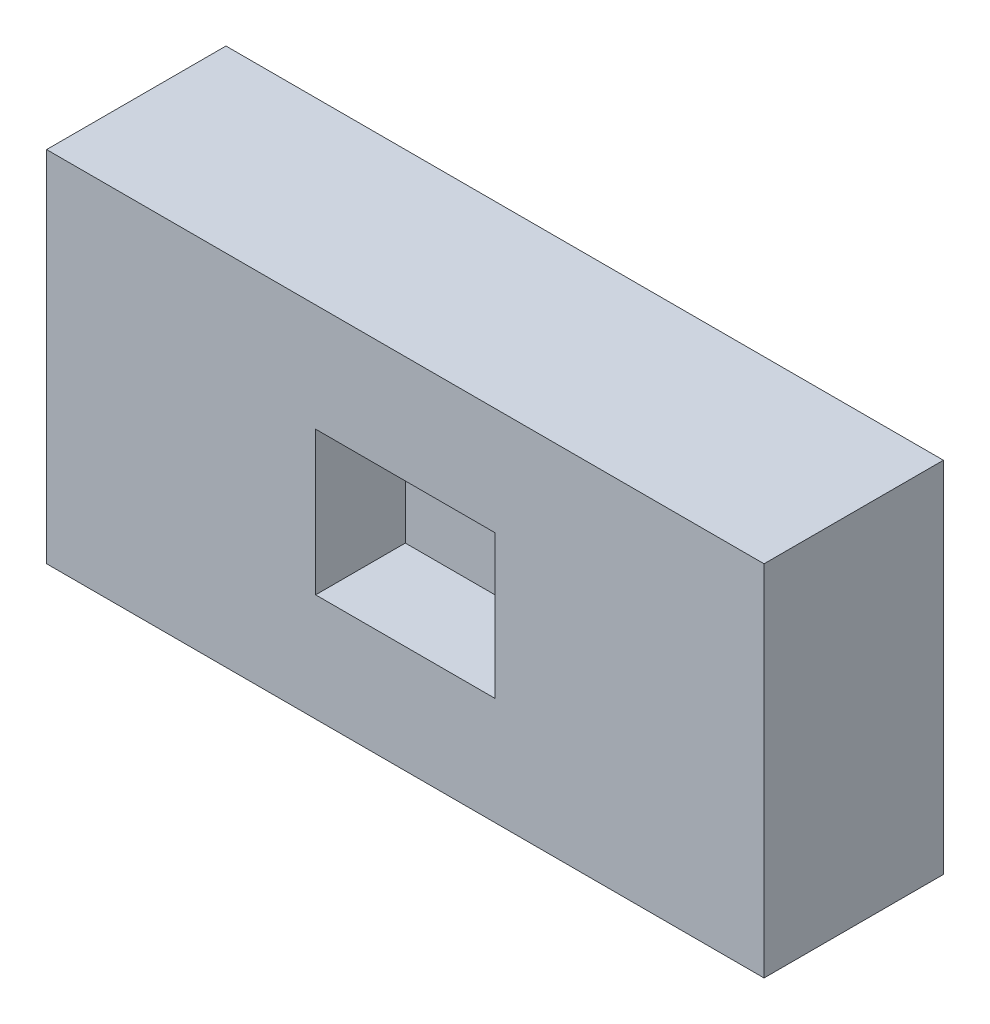
ISO-10303-21;
HEADER;
FILE_DESCRIPTION(('STEP AP214'),'2;1');
FILE_NAME('part.step','',(''),(''),'','','');
FILE_SCHEMA(('AUTOMOTIVE_DESIGN { 1 0 10303 214 1 1 1 1 }'));
ENDSEC;
DATA;
#1=APPLICATION_CONTEXT('core data for automotive mechanical design processes');
#2=APPLICATION_PROTOCOL_DEFINITION('international standard','automotive_design',2000,#1);
#3=PRODUCT_CONTEXT('',#1,'mechanical');
#4=PRODUCT('Part','Part','',(#3));
#5=PRODUCT_RELATED_PRODUCT_CATEGORY('part','',(#4));
#6=PRODUCT_DEFINITION_FORMATION('','',#4);
#7=PRODUCT_DEFINITION_CONTEXT('part definition',#1,'design');
#8=PRODUCT_DEFINITION('design','',#6,#7);
#9=PRODUCT_DEFINITION_SHAPE('','',#8);
#10=(LENGTH_UNIT() NAMED_UNIT(*) SI_UNIT(.MILLI.,.METRE.));
#11=(NAMED_UNIT(*) PLANE_ANGLE_UNIT() SI_UNIT($,.RADIAN.));
#12=(NAMED_UNIT(*) SI_UNIT($,.STERADIAN.) SOLID_ANGLE_UNIT());
#13=UNCERTAINTY_MEASURE_WITH_UNIT(LENGTH_MEASURE(1.E-05),#10,'distance_accuracy_value','');
#14=(GEOMETRIC_REPRESENTATION_CONTEXT(3) GLOBAL_UNCERTAINTY_ASSIGNED_CONTEXT((#13)) GLOBAL_UNIT_ASSIGNED_CONTEXT((#10,
#11,#12)) REPRESENTATION_CONTEXT('',''));
#15=CARTESIAN_POINT('',(0.,0.,0.));
#16=DIRECTION('',(0.,0.,1.));
#17=DIRECTION('',(1.,0.,0.));
#18=AXIS2_PLACEMENT_3D('',#15,#16,#17);
#19=CARTESIAN_POINT('',(0.,0.,10.));
#20=DIRECTION('',(1.,0.,0.));
#21=DIRECTION('',(0.,0.,-1.));
#22=AXIS2_PLACEMENT_3D('',#19,#20,#21);
#23=PLANE('',#22);
#24=DIRECTION('',(0.,-1.,0.));
#25=VECTOR('',#24,1.);
#26=CARTESIAN_POINT('',(0.,0.,0.));
#27=LINE('',#26,#25);
#28=CARTESIAN_POINT('',(0.,20.,0.));
#29=VERTEX_POINT('',#28);
#30=CARTESIAN_POINT('',(0.,0.,0.));
#31=VERTEX_POINT('',#30);
#32=EDGE_CURVE('E153',#29,#31,#27,.T.);
#33=ORIENTED_EDGE('',*,*,#32,.T.);
#34=DIRECTION('',(0.,0.,-1.));
#35=VECTOR('',#34,1.);
#36=CARTESIAN_POINT('',(0.,0.,10.));
#37=LINE('',#36,#35);
#38=CARTESIAN_POINT('',(0.,0.,10.));
#39=VERTEX_POINT('',#38);
#40=EDGE_CURVE('E11',#39,#31,#37,.T.);
#41=ORIENTED_EDGE('',*,*,#40,.F.);
#42=DIRECTION('',(0.,-1.,0.));
#43=VECTOR('',#42,1.);
#44=CARTESIAN_POINT('',(0.,0.,10.));
#45=LINE('',#44,#43);
#46=CARTESIAN_POINT('',(0.,20.,10.));
#47=VERTEX_POINT('',#46);
#48=EDGE_CURVE('E160',#47,#39,#45,.T.);
#49=ORIENTED_EDGE('',*,*,#48,.F.);
#50=DIRECTION('',(0.,0.,-1.));
#51=VECTOR('',#50,1.);
#52=CARTESIAN_POINT('',(0.,20.,10.));
#53=LINE('',#52,#51);
#54=EDGE_CURVE('E162',#47,#29,#53,.T.);
#55=ORIENTED_EDGE('',*,*,#54,.T.);
#56=EDGE_LOOP('',(#33,#41,#49,#55));
#57=FACE_BOUND('',#56,.T.);
#58=ADVANCED_FACE('F44',(#57),#23,.F.);
#59=CARTESIAN_POINT('',(0.,0.,10.));
#60=DIRECTION('',(0.,1.,0.));
#61=DIRECTION('',(0.,0.,1.));
#62=AXIS2_PLACEMENT_3D('',#59,#60,#61);
#63=PLANE('',#62);
#64=DIRECTION('',(1.,0.,0.));
#65=VECTOR('',#64,1.);
#66=CARTESIAN_POINT('',(0.,0.,0.));
#67=LINE('',#66,#65);
#68=CARTESIAN_POINT('',(40.,0.,0.));
#69=VERTEX_POINT('',#68);
#70=EDGE_CURVE('E167',#31,#69,#67,.T.);
#71=ORIENTED_EDGE('',*,*,#70,.T.);
#72=DIRECTION('',(0.,0.,-1.));
#73=VECTOR('',#72,1.);
#74=CARTESIAN_POINT('',(40.,0.,10.));
#75=LINE('',#74,#73);
#76=CARTESIAN_POINT('',(40.,0.,10.));
#77=VERTEX_POINT('',#76);
#78=EDGE_CURVE('E55',#77,#69,#75,.T.);
#79=ORIENTED_EDGE('',*,*,#78,.F.);
#80=DIRECTION('',(1.,0.,0.));
#81=VECTOR('',#80,1.);
#82=CARTESIAN_POINT('',(0.,0.,10.));
#83=LINE('',#82,#81);
#84=EDGE_CURVE('E96',#39,#77,#83,.T.);
#85=ORIENTED_EDGE('',*,*,#84,.F.);
#86=ORIENTED_EDGE('',*,*,#40,.T.);
#87=EDGE_LOOP('',(#71,#79,#85,#86));
#88=FACE_BOUND('',#87,.T.);
#89=ADVANCED_FACE('F198',(#88),#63,.F.);
#90=CARTESIAN_POINT('',(40.,0.,10.));
#91=DIRECTION('',(-1.,0.,0.));
#92=DIRECTION('',(0.,0.,1.));
#93=AXIS2_PLACEMENT_3D('',#90,#91,#92);
#94=PLANE('',#93);
#95=DIRECTION('',(0.,1.,0.));
#96=VECTOR('',#95,1.);
#97=CARTESIAN_POINT('',(40.,0.,0.));
#98=LINE('',#97,#96);
#99=CARTESIAN_POINT('',(40.,20.,0.));
#100=VERTEX_POINT('',#99);
#101=EDGE_CURVE('E169',#69,#100,#98,.T.);
#102=ORIENTED_EDGE('',*,*,#101,.T.);
#103=DIRECTION('',(0.,0.,-1.));
#104=VECTOR('',#103,1.);
#105=CARTESIAN_POINT('',(40.,20.,10.));
#106=LINE('',#105,#104);
#107=CARTESIAN_POINT('',(40.,20.,10.));
#108=VERTEX_POINT('',#107);
#109=EDGE_CURVE('E174',#108,#100,#106,.T.);
#110=ORIENTED_EDGE('',*,*,#109,.F.);
#111=DIRECTION('',(0.,1.,0.));
#112=VECTOR('',#111,1.);
#113=CARTESIAN_POINT('',(40.,0.,10.));
#114=LINE('',#113,#112);
#115=EDGE_CURVE('E159',#77,#108,#114,.T.);
#116=ORIENTED_EDGE('',*,*,#115,.F.);
#117=ORIENTED_EDGE('',*,*,#78,.T.);
#118=EDGE_LOOP('',(#102,#110,#116,#117));
#119=FACE_BOUND('',#118,.T.);
#120=ADVANCED_FACE('F177',(#119),#94,.F.);
#121=CARTESIAN_POINT('',(0.,20.,10.));
#122=DIRECTION('',(0.,-1.,0.));
#123=DIRECTION('',(0.,0.,-1.));
#124=AXIS2_PLACEMENT_3D('',#121,#122,#123);
#125=PLANE('',#124);
#126=DIRECTION('',(-1.,0.,0.));
#127=VECTOR('',#126,1.);
#128=CARTESIAN_POINT('',(0.,20.,0.));
#129=LINE('',#128,#127);
#130=EDGE_CURVE('E90',#100,#29,#129,.T.);
#131=ORIENTED_EDGE('',*,*,#130,.T.);
#132=ORIENTED_EDGE('',*,*,#54,.F.);
#133=DIRECTION('',(-1.,0.,0.));
#134=VECTOR('',#133,1.);
#135=CARTESIAN_POINT('',(0.,20.,10.));
#136=LINE('',#135,#134);
#137=EDGE_CURVE('E69',#108,#47,#136,.T.);
#138=ORIENTED_EDGE('',*,*,#137,.F.);
#139=ORIENTED_EDGE('',*,*,#109,.T.);
#140=EDGE_LOOP('',(#131,#132,#138,#139));
#141=FACE_BOUND('',#140,.T.);
#142=ADVANCED_FACE('F183',(#141),#125,.F.);
#143=CARTESIAN_POINT('',(0.,0.,10.));
#144=DIRECTION('',(0.,0.,-1.));
#145=DIRECTION('',(-1.,0.,0.));
#146=AXIS2_PLACEMENT_3D('',#143,#144,#145);
#147=PLANE('',#146);
#148=DIRECTION('',(1.,0.,0.));
#149=VECTOR('',#148,1.);
#150=CARTESIAN_POINT('',(15.,6.,10.));
#151=LINE('',#150,#149);
#152=CARTESIAN_POINT('',(15.,6.,10.));
#153=VERTEX_POINT('',#152);
#154=CARTESIAN_POINT('',(25.,6.,10.));
#155=VERTEX_POINT('',#154);
#156=EDGE_CURVE('E150',#153,#155,#151,.T.);
#157=ORIENTED_EDGE('',*,*,#156,.F.);
#158=DIRECTION('',(0.,-1.,0.));
#159=VECTOR('',#158,1.);
#160=CARTESIAN_POINT('',(15.,6.,10.));
#161=LINE('',#160,#159);
#162=CARTESIAN_POINT('',(15.,14.,10.));
#163=VERTEX_POINT('',#162);
#164=EDGE_CURVE('E56',#163,#153,#161,.T.);
#165=ORIENTED_EDGE('',*,*,#164,.F.);
#166=DIRECTION('',(-1.,0.,0.));
#167=VECTOR('',#166,1.);
#168=CARTESIAN_POINT('',(15.,14.,10.));
#169=LINE('',#168,#167);
#170=CARTESIAN_POINT('',(25.,14.,10.));
#171=VERTEX_POINT('',#170);
#172=EDGE_CURVE('E139',#171,#163,#169,.T.);
#173=ORIENTED_EDGE('',*,*,#172,.F.);
#174=DIRECTION('',(0.,1.,0.));
#175=VECTOR('',#174,1.);
#176=CARTESIAN_POINT('',(25.,6.,10.));
#177=LINE('',#176,#175);
#178=EDGE_CURVE('E143',#155,#171,#177,.T.);
#179=ORIENTED_EDGE('',*,*,#178,.F.);
#180=EDGE_LOOP('',(#157,#165,#173,#179));
#181=FACE_BOUND('',#180,.T.);
#182=ORIENTED_EDGE('',*,*,#48,.T.);
#183=ORIENTED_EDGE('',*,*,#84,.T.);
#184=ORIENTED_EDGE('',*,*,#115,.T.);
#185=ORIENTED_EDGE('',*,*,#137,.T.);
#186=EDGE_LOOP('',(#182,#183,#184,#185));
#187=FACE_BOUND('',#186,.T.);
#188=ADVANCED_FACE('F189',(#181,#187),#147,.F.);
#189=CARTESIAN_POINT('',(0.,0.,0.));
#190=DIRECTION('',(0.,0.,-1.));
#191=DIRECTION('',(-1.,0.,0.));
#192=AXIS2_PLACEMENT_3D('',#189,#190,#191);
#193=PLANE('',#192);
#194=ORIENTED_EDGE('',*,*,#32,.F.);
#195=ORIENTED_EDGE('',*,*,#130,.F.);
#196=ORIENTED_EDGE('',*,*,#101,.F.);
#197=ORIENTED_EDGE('',*,*,#70,.F.);
#198=EDGE_LOOP('',(#194,#195,#196,#197));
#199=FACE_BOUND('',#198,.T.);
#200=ADVANCED_FACE('F182',(#199),#193,.T.);
#201=CARTESIAN_POINT('',(15.,6.,5.));
#202=DIRECTION('',(-1.,0.,0.));
#203=DIRECTION('',(0.,0.,1.));
#204=AXIS2_PLACEMENT_3D('',#201,#202,#203);
#205=PLANE('',#204);
#206=ORIENTED_EDGE('',*,*,#164,.T.);
#207=DIRECTION('',(0.,0.,1.));
#208=VECTOR('',#207,1.);
#209=CARTESIAN_POINT('',(15.,6.,5.));
#210=LINE('',#209,#208);
#211=CARTESIAN_POINT('',(15.,6.,5.));
#212=VERTEX_POINT('',#211);
#213=EDGE_CURVE('E117',#212,#153,#210,.T.);
#214=ORIENTED_EDGE('',*,*,#213,.F.);
#215=DIRECTION('',(0.,-1.,0.));
#216=VECTOR('',#215,1.);
#217=CARTESIAN_POINT('',(15.,6.,5.));
#218=LINE('',#217,#216);
#219=CARTESIAN_POINT('',(15.,14.,5.));
#220=VERTEX_POINT('',#219);
#221=EDGE_CURVE('E118',#220,#212,#218,.T.);
#222=ORIENTED_EDGE('',*,*,#221,.F.);
#223=DIRECTION('',(0.,0.,1.));
#224=VECTOR('',#223,1.);
#225=CARTESIAN_POINT('',(15.,14.,5.));
#226=LINE('',#225,#224);
#227=EDGE_CURVE('E151',#220,#163,#226,.T.);
#228=ORIENTED_EDGE('',*,*,#227,.T.);
#229=EDGE_LOOP('',(#206,#214,#222,#228));
#230=FACE_BOUND('',#229,.T.);
#231=ADVANCED_FACE('F120',(#230),#205,.F.);
#232=CARTESIAN_POINT('',(15.,14.,5.));
#233=DIRECTION('',(0.,1.,0.));
#234=DIRECTION('',(0.,0.,1.));
#235=AXIS2_PLACEMENT_3D('',#232,#233,#234);
#236=PLANE('',#235);
#237=ORIENTED_EDGE('',*,*,#172,.T.);
#238=ORIENTED_EDGE('',*,*,#227,.F.);
#239=DIRECTION('',(-1.,0.,0.));
#240=VECTOR('',#239,1.);
#241=CARTESIAN_POINT('',(15.,14.,5.));
#242=LINE('',#241,#240);
#243=CARTESIAN_POINT('',(25.,14.,5.));
#244=VERTEX_POINT('',#243);
#245=EDGE_CURVE('E127',#244,#220,#242,.T.);
#246=ORIENTED_EDGE('',*,*,#245,.F.);
#247=DIRECTION('',(0.,0.,1.));
#248=VECTOR('',#247,1.);
#249=CARTESIAN_POINT('',(25.,14.,5.));
#250=LINE('',#249,#248);
#251=EDGE_CURVE('E152',#244,#171,#250,.T.);
#252=ORIENTED_EDGE('',*,*,#251,.T.);
#253=EDGE_LOOP('',(#237,#238,#246,#252));
#254=FACE_BOUND('',#253,.T.);
#255=ADVANCED_FACE('F240',(#254),#236,.F.);
#256=CARTESIAN_POINT('',(25.,6.,5.));
#257=DIRECTION('',(1.,0.,0.));
#258=DIRECTION('',(0.,0.,-1.));
#259=AXIS2_PLACEMENT_3D('',#256,#257,#258);
#260=PLANE('',#259);
#261=ORIENTED_EDGE('',*,*,#178,.T.);
#262=ORIENTED_EDGE('',*,*,#251,.F.);
#263=DIRECTION('',(0.,1.,0.));
#264=VECTOR('',#263,1.);
#265=CARTESIAN_POINT('',(25.,6.,5.));
#266=LINE('',#265,#264);
#267=CARTESIAN_POINT('',(25.,6.,5.));
#268=VERTEX_POINT('',#267);
#269=EDGE_CURVE('E131',#268,#244,#266,.T.);
#270=ORIENTED_EDGE('',*,*,#269,.F.);
#271=DIRECTION('',(0.,0.,1.));
#272=VECTOR('',#271,1.);
#273=CARTESIAN_POINT('',(25.,6.,5.));
#274=LINE('',#273,#272);
#275=EDGE_CURVE('E125',#268,#155,#274,.T.);
#276=ORIENTED_EDGE('',*,*,#275,.T.);
#277=EDGE_LOOP('',(#261,#262,#270,#276));
#278=FACE_BOUND('',#277,.T.);
#279=ADVANCED_FACE('F246',(#278),#260,.F.);
#280=CARTESIAN_POINT('',(15.,6.,5.));
#281=DIRECTION('',(0.,-1.,0.));
#282=DIRECTION('',(0.,0.,-1.));
#283=AXIS2_PLACEMENT_3D('',#280,#281,#282);
#284=PLANE('',#283);
#285=ORIENTED_EDGE('',*,*,#156,.T.);
#286=ORIENTED_EDGE('',*,*,#275,.F.);
#287=DIRECTION('',(1.,0.,0.));
#288=VECTOR('',#287,1.);
#289=CARTESIAN_POINT('',(15.,6.,5.));
#290=LINE('',#289,#288);
#291=EDGE_CURVE('E129',#212,#268,#290,.T.);
#292=ORIENTED_EDGE('',*,*,#291,.F.);
#293=ORIENTED_EDGE('',*,*,#213,.T.);
#294=EDGE_LOOP('',(#285,#286,#292,#293));
#295=FACE_BOUND('',#294,.T.);
#296=ADVANCED_FACE('F128',(#295),#284,.F.);
#297=CARTESIAN_POINT('',(0.,0.,5.));
#298=DIRECTION('',(0.,0.,-1.));
#299=DIRECTION('',(-1.,0.,0.));
#300=AXIS2_PLACEMENT_3D('',#297,#298,#299);
#301=PLANE('',#300);
#302=ORIENTED_EDGE('',*,*,#221,.T.);
#303=ORIENTED_EDGE('',*,*,#291,.T.);
#304=ORIENTED_EDGE('',*,*,#269,.T.);
#305=ORIENTED_EDGE('',*,*,#245,.T.);
#306=EDGE_LOOP('',(#302,#303,#304,#305));
#307=FACE_BOUND('',#306,.T.);
#308=ADVANCED_FACE('F136',(#307),#301,.F.);
#309=CLOSED_SHELL('',(#58,#89,#120,#142,#188,#200,#231,#255,#279,#296,#308));
#310=MANIFOLD_SOLID_BREP('B2',#309);
#311=ADVANCED_BREP_SHAPE_REPRESENTATION('',(#18,#310),#14);
#312=SHAPE_DEFINITION_REPRESENTATION(#9,#311);
ENDSEC;
END-ISO-10303-21;
